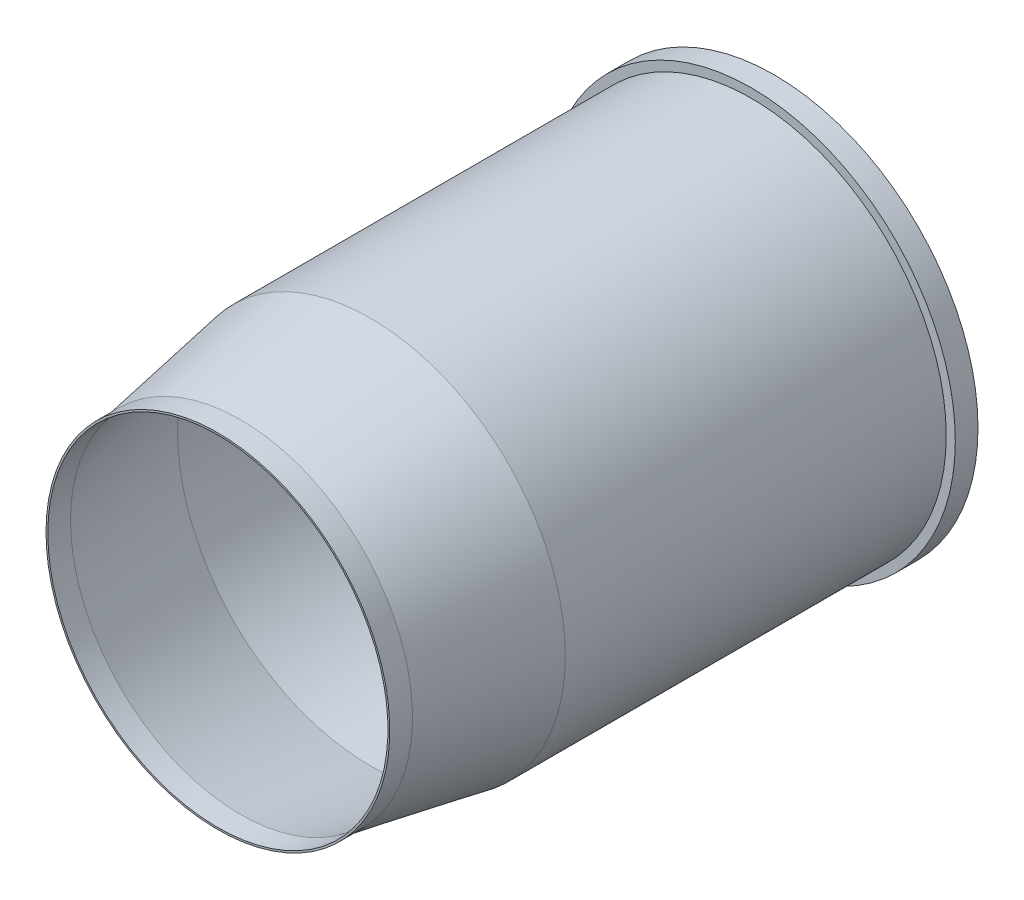
ISO-10303-21;
HEADER;
FILE_DESCRIPTION(('STEP AP214'),'2;1');
FILE_NAME('part.step','',(''),(''),'','','');
FILE_SCHEMA(('AUTOMOTIVE_DESIGN { 1 0 10303 214 1 1 1 1 }'));
ENDSEC;
DATA;
#1=APPLICATION_CONTEXT('core data for automotive mechanical design processes');
#2=APPLICATION_PROTOCOL_DEFINITION('international standard','automotive_design',2000,#1);
#3=PRODUCT_CONTEXT('',#1,'mechanical');
#4=PRODUCT('Part','Part','',(#3));
#5=PRODUCT_RELATED_PRODUCT_CATEGORY('part','',(#4));
#6=PRODUCT_DEFINITION_FORMATION('','',#4);
#7=PRODUCT_DEFINITION_CONTEXT('part definition',#1,'design');
#8=PRODUCT_DEFINITION('design','',#6,#7);
#9=PRODUCT_DEFINITION_SHAPE('','',#8);
#10=(LENGTH_UNIT() NAMED_UNIT(*) SI_UNIT(.MILLI.,.METRE.));
#11=(NAMED_UNIT(*) PLANE_ANGLE_UNIT() SI_UNIT($,.RADIAN.));
#12=(NAMED_UNIT(*) SI_UNIT($,.STERADIAN.) SOLID_ANGLE_UNIT());
#13=UNCERTAINTY_MEASURE_WITH_UNIT(LENGTH_MEASURE(1.E-05),#10,'distance_accuracy_value','');
#14=(GEOMETRIC_REPRESENTATION_CONTEXT(3) GLOBAL_UNCERTAINTY_ASSIGNED_CONTEXT((#13)) GLOBAL_UNIT_ASSIGNED_CONTEXT((#10,
#11,#12)) REPRESENTATION_CONTEXT('',''));
#15=CARTESIAN_POINT('',(0.,0.,0.));
#16=DIRECTION('',(0.,0.,1.));
#17=DIRECTION('',(1.,0.,0.));
#18=AXIS2_PLACEMENT_3D('',#15,#16,#17);
#19=CARTESIAN_POINT('',(0.,44.9,0.));
#20=DIRECTION('',(0.,0.,-1.));
#21=DIRECTION('',(-1.,0.,0.));
#22=AXIS2_PLACEMENT_3D('',#19,#20,#21);
#23=PLANE('',#22);
#24=CARTESIAN_POINT('',(0.,0.,0.));
#25=DIRECTION('',(0.,0.,-1.));
#26=DIRECTION('',(-1.,0.,0.));
#27=AXIS2_PLACEMENT_3D('',#24,#25,#26);
#28=CIRCLE('',#27,44.9);
#29=CARTESIAN_POINT('',(-44.9,0.,0.));
#30=VERTEX_POINT('',#29);
#31=EDGE_CURVE('E66',#30,#30,#28,.T.);
#32=ORIENTED_EDGE('',*,*,#31,.T.);
#33=EDGE_LOOP('',(#32));
#34=FACE_BOUND('',#33,.T.);
#35=CARTESIAN_POINT('',(0.,0.,0.));
#36=DIRECTION('',(0.,0.,-1.));
#37=DIRECTION('',(-1.,0.,0.));
#38=AXIS2_PLACEMENT_3D('',#35,#36,#37);
#39=CIRCLE('',#38,42.5);
#40=CARTESIAN_POINT('',(-42.5,0.,0.));
#41=VERTEX_POINT('',#40);
#42=EDGE_CURVE('E10',#41,#41,#39,.T.);
#43=ORIENTED_EDGE('',*,*,#42,.F.);
#44=EDGE_LOOP('',(#43));
#45=FACE_BOUND('',#44,.T.);
#46=ADVANCED_FACE('F32',(#34,#45),#23,.T.);
#47=CARTESIAN_POINT('',(0.,0.,0.));
#48=DIRECTION('',(0.,0.,-1.));
#49=DIRECTION('',(-1.,0.,0.));
#50=AXIS2_PLACEMENT_3D('',#47,#48,#49);
#51=CYLINDRICAL_SURFACE('',#50,42.5);
#52=ORIENTED_EDGE('',*,*,#42,.T.);
#53=EDGE_LOOP('',(#52));
#54=FACE_BOUND('',#53,.T.);
#55=CARTESIAN_POINT('',(0.,0.,88.877040656389));
#56=DIRECTION('',(0.,0.,-1.));
#57=DIRECTION('',(-1.,0.,0.));
#58=AXIS2_PLACEMENT_3D('',#55,#56,#57);
#59=CIRCLE('',#58,42.5);
#60=CARTESIAN_POINT('',(-42.5,0.,88.877040656389));
#61=VERTEX_POINT('',#60);
#62=EDGE_CURVE('E38',#61,#61,#59,.T.);
#63=ORIENTED_EDGE('',*,*,#62,.F.);
#64=EDGE_LOOP('',(#63));
#65=FACE_BOUND('',#64,.T.);
#66=ADVANCED_FACE('F84',(#54,#65),#51,.F.);
#67=CARTESIAN_POINT('',(0.,0.,117.5));
#68=DIRECTION('',(0.,0.,-1.));
#69=DIRECTION('',(-1.,0.,0.));
#70=AXIS2_PLACEMENT_3D('',#67,#68,#69);
#71=CONICAL_SURFACE('',#70,37.453,0.17453292519943);
#72=ORIENTED_EDGE('',*,*,#62,.T.);
#73=EDGE_LOOP('',(#72));
#74=FACE_BOUND('',#73,.T.);
#75=CARTESIAN_POINT('',(0.,0.,117.5));
#76=DIRECTION('',(0.,0.,-1.));
#77=DIRECTION('',(-1.,0.,0.));
#78=AXIS2_PLACEMENT_3D('',#75,#76,#77);
#79=CIRCLE('',#78,37.453);
#80=CARTESIAN_POINT('',(-37.453,0.,117.5));
#81=VERTEX_POINT('',#80);
#82=EDGE_CURVE('E42',#81,#81,#79,.T.);
#83=ORIENTED_EDGE('',*,*,#82,.F.);
#84=EDGE_LOOP('',(#83));
#85=FACE_BOUND('',#84,.T.);
#86=ADVANCED_FACE('F88',(#74,#85),#71,.F.);
#87=CARTESIAN_POINT('',(0.,0.,0.));
#88=DIRECTION('',(0.,0.,-1.));
#89=DIRECTION('',(-1.,0.,0.));
#90=AXIS2_PLACEMENT_3D('',#87,#88,#89);
#91=CYLINDRICAL_SURFACE('',#90,37.453);
#92=ORIENTED_EDGE('',*,*,#82,.T.);
#93=EDGE_LOOP('',(#92));
#94=FACE_BOUND('',#93,.T.);
#95=CARTESIAN_POINT('',(0.,0.,122.5));
#96=DIRECTION('',(0.,0.,-1.));
#97=DIRECTION('',(-1.,0.,0.));
#98=AXIS2_PLACEMENT_3D('',#95,#96,#97);
#99=CIRCLE('',#98,37.453);
#100=CARTESIAN_POINT('',(-37.453,0.,122.5));
#101=VERTEX_POINT('',#100);
#102=EDGE_CURVE('E46',#101,#101,#99,.T.);
#103=ORIENTED_EDGE('',*,*,#102,.F.);
#104=EDGE_LOOP('',(#103));
#105=FACE_BOUND('',#104,.T.);
#106=ADVANCED_FACE('F92',(#94,#105),#91,.F.);
#107=CARTESIAN_POINT('',(0.,37.853,122.5));
#108=DIRECTION('',(0.,0.,1.));
#109=DIRECTION('',(1.,0.,0.));
#110=AXIS2_PLACEMENT_3D('',#107,#108,#109);
#111=PLANE('',#110);
#112=ORIENTED_EDGE('',*,*,#102,.T.);
#113=EDGE_LOOP('',(#112));
#114=FACE_BOUND('',#113,.T.);
#115=CARTESIAN_POINT('',(0.,0.,122.5));
#116=DIRECTION('',(0.,0.,-1.));
#117=DIRECTION('',(-1.,0.,0.));
#118=AXIS2_PLACEMENT_3D('',#115,#116,#117);
#119=CIRCLE('',#118,37.853);
#120=CARTESIAN_POINT('',(-37.853,0.,122.5));
#121=VERTEX_POINT('',#120);
#122=EDGE_CURVE('E51',#121,#121,#119,.T.);
#123=ORIENTED_EDGE('',*,*,#122,.F.);
#124=EDGE_LOOP('',(#123));
#125=FACE_BOUND('',#124,.T.);
#126=ADVANCED_FACE('F98',(#114,#125),#111,.T.);
#127=CARTESIAN_POINT('',(0.,0.,0.));
#128=DIRECTION('',(0.,0.,-1.));
#129=DIRECTION('',(-1.,0.,0.));
#130=AXIS2_PLACEMENT_3D('',#127,#128,#129);
#131=CYLINDRICAL_SURFACE('',#130,37.853);
#132=ORIENTED_EDGE('',*,*,#122,.T.);
#133=EDGE_LOOP('',(#132));
#134=FACE_BOUND('',#133,.T.);
#135=CARTESIAN_POINT('',(0.,0.,117.5));
#136=DIRECTION('',(0.,0.,-1.));
#137=DIRECTION('',(-1.,0.,0.));
#138=AXIS2_PLACEMENT_3D('',#135,#136,#137);
#139=CIRCLE('',#138,37.853);
#140=CARTESIAN_POINT('',(-37.853,0.,117.5));
#141=VERTEX_POINT('',#140);
#142=EDGE_CURVE('E54',#141,#141,#139,.T.);
#143=ORIENTED_EDGE('',*,*,#142,.F.);
#144=EDGE_LOOP('',(#143));
#145=FACE_BOUND('',#144,.T.);
#146=ADVANCED_FACE('F102',(#134,#145),#131,.T.);
#147=CARTESIAN_POINT('',(0.,0.,88.877040656389));
#148=DIRECTION('',(0.,0.,-1.));
#149=DIRECTION('',(-1.,0.,0.));
#150=AXIS2_PLACEMENT_3D('',#147,#148,#149);
#151=CONICAL_SURFACE('',#150,42.9,0.17453292519943);
#152=ORIENTED_EDGE('',*,*,#142,.T.);
#153=EDGE_LOOP('',(#152));
#154=FACE_BOUND('',#153,.T.);
#155=CARTESIAN_POINT('',(0.,0.,88.877040656389));
#156=DIRECTION('',(0.,0.,-1.));
#157=DIRECTION('',(-1.,0.,0.));
#158=AXIS2_PLACEMENT_3D('',#155,#156,#157);
#159=CIRCLE('',#158,42.9);
#160=CARTESIAN_POINT('',(-42.9,0.,88.877040656389));
#161=VERTEX_POINT('',#160);
#162=EDGE_CURVE('E57',#161,#161,#159,.T.);
#163=ORIENTED_EDGE('',*,*,#162,.F.);
#164=EDGE_LOOP('',(#163));
#165=FACE_BOUND('',#164,.T.);
#166=ADVANCED_FACE('F106',(#154,#165),#151,.T.);
#167=CARTESIAN_POINT('',(0.,0.,0.));
#168=DIRECTION('',(0.,0.,-1.));
#169=DIRECTION('',(-1.,0.,0.));
#170=AXIS2_PLACEMENT_3D('',#167,#168,#169);
#171=CYLINDRICAL_SURFACE('',#170,42.9);
#172=ORIENTED_EDGE('',*,*,#162,.T.);
#173=EDGE_LOOP('',(#172));
#174=FACE_BOUND('',#173,.T.);
#175=CARTESIAN_POINT('',(0.,0.,5.));
#176=DIRECTION('',(0.,0.,-1.));
#177=DIRECTION('',(-1.,0.,0.));
#178=AXIS2_PLACEMENT_3D('',#175,#176,#177);
#179=CIRCLE('',#178,42.9);
#180=CARTESIAN_POINT('',(-42.9,0.,5.));
#181=VERTEX_POINT('',#180);
#182=EDGE_CURVE('E60',#181,#181,#179,.T.);
#183=ORIENTED_EDGE('',*,*,#182,.F.);
#184=EDGE_LOOP('',(#183));
#185=FACE_BOUND('',#184,.T.);
#186=ADVANCED_FACE('F80',(#174,#185),#171,.T.);
#187=CARTESIAN_POINT('',(0.,42.9,5.));
#188=DIRECTION('',(0.,0.,1.));
#189=DIRECTION('',(1.,0.,0.));
#190=AXIS2_PLACEMENT_3D('',#187,#188,#189);
#191=PLANE('',#190);
#192=ORIENTED_EDGE('',*,*,#182,.T.);
#193=EDGE_LOOP('',(#192));
#194=FACE_BOUND('',#193,.T.);
#195=CARTESIAN_POINT('',(0.,0.,5.));
#196=DIRECTION('',(0.,0.,-1.));
#197=DIRECTION('',(-1.,0.,0.));
#198=AXIS2_PLACEMENT_3D('',#195,#196,#197);
#199=CIRCLE('',#198,44.9);
#200=CARTESIAN_POINT('',(-44.9,0.,5.));
#201=VERTEX_POINT('',#200);
#202=EDGE_CURVE('E63',#201,#201,#199,.T.);
#203=ORIENTED_EDGE('',*,*,#202,.F.);
#204=EDGE_LOOP('',(#203));
#205=FACE_BOUND('',#204,.T.);
#206=ADVANCED_FACE('F74',(#194,#205),#191,.T.);
#207=CARTESIAN_POINT('',(0.,0.,0.));
#208=DIRECTION('',(0.,0.,-1.));
#209=DIRECTION('',(-1.,0.,0.));
#210=AXIS2_PLACEMENT_3D('',#207,#208,#209);
#211=CYLINDRICAL_SURFACE('',#210,44.9);
#212=ORIENTED_EDGE('',*,*,#202,.T.);
#213=EDGE_LOOP('',(#212));
#214=FACE_BOUND('',#213,.T.);
#215=ORIENTED_EDGE('',*,*,#31,.F.);
#216=EDGE_LOOP('',(#215));
#217=FACE_BOUND('',#216,.T.);
#218=ADVANCED_FACE('F72',(#214,#217),#211,.T.);
#219=CLOSED_SHELL('',(#46,#66,#86,#106,#126,#146,#166,#186,#206,#218));
#220=MANIFOLD_SOLID_BREP('B2',#219);
#221=ADVANCED_BREP_SHAPE_REPRESENTATION('',(#18,#220),#14);
#222=SHAPE_DEFINITION_REPRESENTATION(#9,#221);
ENDSEC;
END-ISO-10303-21;
